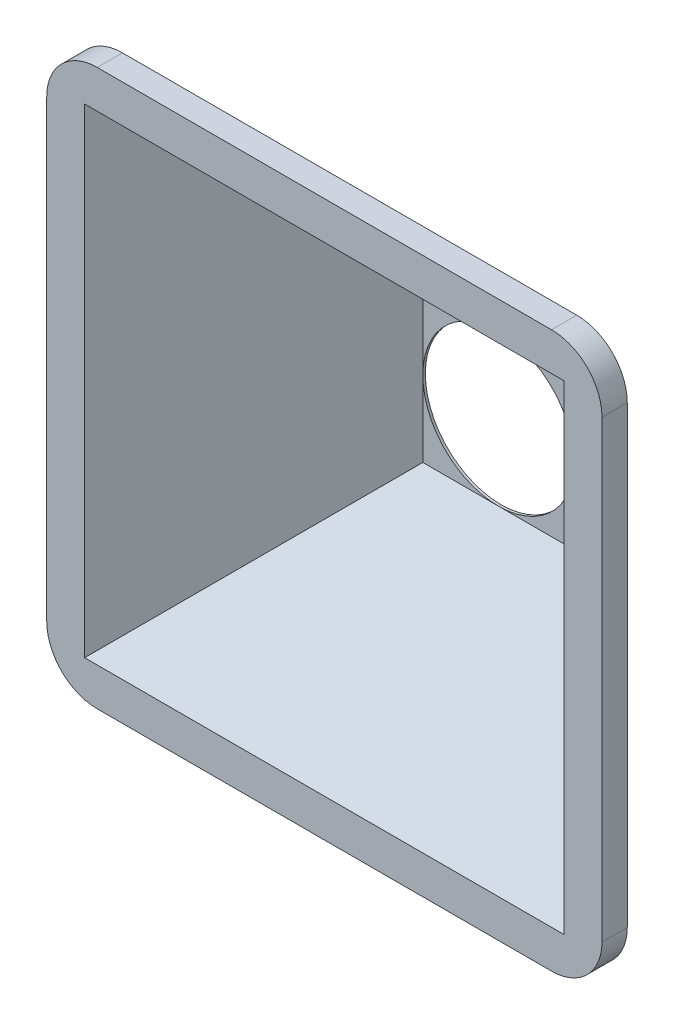
ISO-10303-21;
HEADER;
FILE_DESCRIPTION(('STEP AP214'),'2;1');
FILE_NAME('part.step','',(''),(''),'','','');
FILE_SCHEMA(('AUTOMOTIVE_DESIGN { 1 0 10303 214 1 1 1 1 }'));
ENDSEC;
DATA;
#1=APPLICATION_CONTEXT('core data for automotive mechanical design processes');
#2=APPLICATION_PROTOCOL_DEFINITION('international standard','automotive_design',2000,#1);
#3=PRODUCT_CONTEXT('',#1,'mechanical');
#4=PRODUCT('Part','Part','',(#3));
#5=PRODUCT_RELATED_PRODUCT_CATEGORY('part','',(#4));
#6=PRODUCT_DEFINITION_FORMATION('','',#4);
#7=PRODUCT_DEFINITION_CONTEXT('part definition',#1,'design');
#8=PRODUCT_DEFINITION('design','',#6,#7);
#9=PRODUCT_DEFINITION_SHAPE('','',#8);
#10=(LENGTH_UNIT() NAMED_UNIT(*) SI_UNIT(.MILLI.,.METRE.));
#11=(NAMED_UNIT(*) PLANE_ANGLE_UNIT() SI_UNIT($,.RADIAN.));
#12=(NAMED_UNIT(*) SI_UNIT($,.STERADIAN.) SOLID_ANGLE_UNIT());
#13=UNCERTAINTY_MEASURE_WITH_UNIT(LENGTH_MEASURE(1.E-05),#10,'distance_accuracy_value','');
#14=(GEOMETRIC_REPRESENTATION_CONTEXT(3) GLOBAL_UNCERTAINTY_ASSIGNED_CONTEXT((#13)) GLOBAL_UNIT_ASSIGNED_CONTEXT((#10,
#11,#12)) REPRESENTATION_CONTEXT('',''));
#15=CARTESIAN_POINT('',(0.,0.,0.));
#16=DIRECTION('',(0.,0.,1.));
#17=DIRECTION('',(1.,0.,0.));
#18=AXIS2_PLACEMENT_3D('',#15,#16,#17);
#19=CARTESIAN_POINT('',(0.,0.,5.));
#20=DIRECTION('',(0.,0.,-1.));
#21=DIRECTION('',(-1.,0.,0.));
#22=AXIS2_PLACEMENT_3D('',#19,#20,#21);
#23=CYLINDRICAL_SURFACE('',#22,150.);
#24=CARTESIAN_POINT('',(0.,0.,0.));
#25=DIRECTION('',(0.,0.,1.));
#26=DIRECTION('',(1.,0.,0.));
#27=AXIS2_PLACEMENT_3D('',#24,#25,#26);
#28=CIRCLE('',#27,150.);
#29=CARTESIAN_POINT('',(0.,-150.,0.));
#30=VERTEX_POINT('',#29);
#31=CARTESIAN_POINT('',(150.,0.,0.));
#32=VERTEX_POINT('',#31);
#33=EDGE_CURVE('E135',#30,#32,#28,.T.);
#34=ORIENTED_EDGE('',*,*,#33,.F.);
#35=DIRECTION('',(0.,0.,-1.));
#36=VECTOR('',#35,1.);
#37=CARTESIAN_POINT('',(0.,-150.,5.));
#38=LINE('',#37,#36);
#39=CARTESIAN_POINT('',(0.,-150.,5.));
#40=VERTEX_POINT('',#39);
#41=EDGE_CURVE('E13',#40,#30,#38,.T.);
#42=ORIENTED_EDGE('',*,*,#41,.F.);
#43=CARTESIAN_POINT('',(0.,0.,5.));
#44=DIRECTION('',(0.,0.,1.));
#45=DIRECTION('',(1.,0.,0.));
#46=AXIS2_PLACEMENT_3D('',#43,#44,#45);
#47=CIRCLE('',#46,150.);
#48=CARTESIAN_POINT('',(150.,0.,5.));
#49=VERTEX_POINT('',#48);
#50=EDGE_CURVE('E133',#40,#49,#47,.T.);
#51=ORIENTED_EDGE('',*,*,#50,.T.);
#52=DIRECTION('',(0.,0.,-1.));
#53=VECTOR('',#52,1.);
#54=CARTESIAN_POINT('',(150.,0.,5.));
#55=LINE('',#54,#53);
#56=EDGE_CURVE('E131',#49,#32,#55,.T.);
#57=ORIENTED_EDGE('',*,*,#56,.T.);
#58=EDGE_LOOP('',(#34,#42,#51,#57));
#59=FACE_BOUND('',#58,.T.);
#60=ADVANCED_FACE('F98',(#59),#23,.F.);
#61=CARTESIAN_POINT('',(0.,-150.,5.));
#62=DIRECTION('',(0.,-1.,0.));
#63=DIRECTION('',(0.,0.,-1.));
#64=AXIS2_PLACEMENT_3D('',#61,#62,#63);
#65=PLANE('',#64);
#66=DIRECTION('',(-1.,0.,0.));
#67=VECTOR('',#66,1.);
#68=CARTESIAN_POINT('',(0.,-150.,0.));
#69=LINE('',#68,#67);
#70=CARTESIAN_POINT('',(150.,-150.,0.));
#71=VERTEX_POINT('',#70);
#72=EDGE_CURVE('E149',#71,#30,#69,.T.);
#73=ORIENTED_EDGE('',*,*,#72,.F.);
#74=DIRECTION('',(0.,0.,-1.));
#75=VECTOR('',#74,1.);
#76=CARTESIAN_POINT('',(150.,-150.,5.));
#77=LINE('',#76,#75);
#78=CARTESIAN_POINT('',(150.,-150.,5.));
#79=VERTEX_POINT('',#78);
#80=EDGE_CURVE('E106',#79,#71,#77,.T.);
#81=ORIENTED_EDGE('',*,*,#80,.F.);
#82=DIRECTION('',(-1.,0.,0.));
#83=VECTOR('',#82,1.);
#84=CARTESIAN_POINT('',(0.,-150.,5.));
#85=LINE('',#84,#83);
#86=EDGE_CURVE('E141',#79,#40,#85,.T.);
#87=ORIENTED_EDGE('',*,*,#86,.T.);
#88=ORIENTED_EDGE('',*,*,#41,.T.);
#89=EDGE_LOOP('',(#73,#81,#87,#88));
#90=FACE_BOUND('',#89,.T.);
#91=ADVANCED_FACE('F144',(#90),#65,.T.);
#92=CARTESIAN_POINT('',(150.,0.,5.));
#93=DIRECTION('',(-1.,0.,0.));
#94=DIRECTION('',(0.,0.,1.));
#95=AXIS2_PLACEMENT_3D('',#92,#93,#94);
#96=PLANE('',#95);
#97=DIRECTION('',(0.,1.,0.));
#98=VECTOR('',#97,1.);
#99=CARTESIAN_POINT('',(150.,0.,0.));
#100=LINE('',#99,#98);
#101=EDGE_CURVE('E142',#71,#32,#100,.T.);
#102=ORIENTED_EDGE('',*,*,#101,.T.);
#103=ORIENTED_EDGE('',*,*,#56,.F.);
#104=DIRECTION('',(0.,1.,0.));
#105=VECTOR('',#104,1.);
#106=CARTESIAN_POINT('',(150.,0.,5.));
#107=LINE('',#106,#105);
#108=EDGE_CURVE('E114',#79,#49,#107,.T.);
#109=ORIENTED_EDGE('',*,*,#108,.F.);
#110=ORIENTED_EDGE('',*,*,#80,.T.);
#111=EDGE_LOOP('',(#102,#103,#109,#110));
#112=FACE_BOUND('',#111,.T.);
#113=ADVANCED_FACE('F152',(#112),#96,.F.);
#114=CARTESIAN_POINT('',(0.,0.,5.));
#115=DIRECTION('',(0.,0.,1.));
#116=DIRECTION('',(1.,0.,0.));
#117=AXIS2_PLACEMENT_3D('',#114,#115,#116);
#118=PLANE('',#117);
#119=ORIENTED_EDGE('',*,*,#50,.F.);
#120=ORIENTED_EDGE('',*,*,#86,.F.);
#121=ORIENTED_EDGE('',*,*,#108,.T.);
#122=EDGE_LOOP('',(#119,#120,#121));
#123=FACE_BOUND('',#122,.T.);
#124=ADVANCED_FACE('F140',(#123),#118,.T.);
#125=CARTESIAN_POINT('',(0.,0.,0.));
#126=DIRECTION('',(0.,0.,1.));
#127=DIRECTION('',(1.,0.,0.));
#128=AXIS2_PLACEMENT_3D('',#125,#126,#127);
#129=PLANE('',#128);
#130=ORIENTED_EDGE('',*,*,#33,.T.);
#131=ORIENTED_EDGE('',*,*,#101,.F.);
#132=ORIENTED_EDGE('',*,*,#72,.T.);
#133=EDGE_LOOP('',(#130,#131,#132));
#134=FACE_BOUND('',#133,.T.);
#135=ADVANCED_FACE('F154',(#134),#129,.F.);
#136=CLOSED_SHELL('',(#60,#91,#113,#124,#135));
#137=MANIFOLD_SOLID_BREP('B2',#136);
#138=CARTESIAN_POINT('',(0.,0.,5.));
#139=DIRECTION('',(0.,0.,-1.));
#140=DIRECTION('',(-1.,0.,0.));
#141=AXIS2_PLACEMENT_3D('',#138,#139,#140);
#142=CYLINDRICAL_SURFACE('',#141,150.);
#143=CARTESIAN_POINT('',(0.,0.,0.));
#144=DIRECTION('',(0.,0.,1.));
#145=DIRECTION('',(1.,0.,0.));
#146=AXIS2_PLACEMENT_3D('',#143,#144,#145);
#147=CIRCLE('',#146,150.);
#148=CARTESIAN_POINT('',(150.,0.,0.));
#149=VERTEX_POINT('',#148);
#150=CARTESIAN_POINT('',(0.,150.,0.));
#151=VERTEX_POINT('',#150);
#152=EDGE_CURVE('E246',#149,#151,#147,.T.);
#153=ORIENTED_EDGE('',*,*,#152,.F.);
#154=DIRECTION('',(0.,0.,-1.));
#155=VECTOR('',#154,1.);
#156=CARTESIAN_POINT('',(150.,0.,5.));
#157=LINE('',#156,#155);
#158=CARTESIAN_POINT('',(150.,0.,5.));
#159=VERTEX_POINT('',#158);
#160=EDGE_CURVE('E96',#159,#149,#157,.T.);
#161=ORIENTED_EDGE('',*,*,#160,.F.);
#162=CARTESIAN_POINT('',(0.,0.,5.));
#163=DIRECTION('',(0.,0.,1.));
#164=DIRECTION('',(1.,0.,0.));
#165=AXIS2_PLACEMENT_3D('',#162,#163,#164);
#166=CIRCLE('',#165,150.);
#167=CARTESIAN_POINT('',(0.,150.,5.));
#168=VERTEX_POINT('',#167);
#169=EDGE_CURVE('E244',#159,#168,#166,.T.);
#170=ORIENTED_EDGE('',*,*,#169,.T.);
#171=DIRECTION('',(0.,0.,-1.));
#172=VECTOR('',#171,1.);
#173=CARTESIAN_POINT('',(0.,150.,5.));
#174=LINE('',#173,#172);
#175=EDGE_CURVE('E240',#168,#151,#174,.T.);
#176=ORIENTED_EDGE('',*,*,#175,.T.);
#177=EDGE_LOOP('',(#153,#161,#170,#176));
#178=FACE_BOUND('',#177,.T.);
#179=ADVANCED_FACE('F206',(#178),#142,.F.);
#180=CARTESIAN_POINT('',(150.,0.,5.));
#181=DIRECTION('',(-1.,0.,0.));
#182=DIRECTION('',(0.,0.,1.));
#183=AXIS2_PLACEMENT_3D('',#180,#181,#182);
#184=PLANE('',#183);
#185=DIRECTION('',(0.,1.,0.));
#186=VECTOR('',#185,1.);
#187=CARTESIAN_POINT('',(150.,0.,0.));
#188=LINE('',#187,#186);
#189=CARTESIAN_POINT('',(150.,150.,0.));
#190=VERTEX_POINT('',#189);
#191=EDGE_CURVE('E234',#149,#190,#188,.T.);
#192=ORIENTED_EDGE('',*,*,#191,.T.);
#193=DIRECTION('',(0.,0.,-1.));
#194=VECTOR('',#193,1.);
#195=CARTESIAN_POINT('',(150.,150.,5.));
#196=LINE('',#195,#194);
#197=CARTESIAN_POINT('',(150.,150.,5.));
#198=VERTEX_POINT('',#197);
#199=EDGE_CURVE('E214',#198,#190,#196,.T.);
#200=ORIENTED_EDGE('',*,*,#199,.F.);
#201=DIRECTION('',(0.,1.,0.));
#202=VECTOR('',#201,1.);
#203=CARTESIAN_POINT('',(150.,0.,5.));
#204=LINE('',#203,#202);
#205=EDGE_CURVE('E247',#159,#198,#204,.T.);
#206=ORIENTED_EDGE('',*,*,#205,.F.);
#207=ORIENTED_EDGE('',*,*,#160,.T.);
#208=EDGE_LOOP('',(#192,#200,#206,#207));
#209=FACE_BOUND('',#208,.T.);
#210=ADVANCED_FACE('F248',(#209),#184,.F.);
#211=CARTESIAN_POINT('',(0.,150.,5.));
#212=DIRECTION('',(0.,-1.,0.));
#213=DIRECTION('',(0.,0.,-1.));
#214=AXIS2_PLACEMENT_3D('',#211,#212,#213);
#215=PLANE('',#214);
#216=DIRECTION('',(-1.,0.,0.));
#217=VECTOR('',#216,1.);
#218=CARTESIAN_POINT('',(0.,150.,0.));
#219=LINE('',#218,#217);
#220=EDGE_CURVE('E251',#190,#151,#219,.T.);
#221=ORIENTED_EDGE('',*,*,#220,.T.);
#222=ORIENTED_EDGE('',*,*,#175,.F.);
#223=DIRECTION('',(-1.,0.,0.));
#224=VECTOR('',#223,1.);
#225=CARTESIAN_POINT('',(0.,150.,5.));
#226=LINE('',#225,#224);
#227=EDGE_CURVE('E222',#198,#168,#226,.T.);
#228=ORIENTED_EDGE('',*,*,#227,.F.);
#229=ORIENTED_EDGE('',*,*,#199,.T.);
#230=EDGE_LOOP('',(#221,#222,#228,#229));
#231=FACE_BOUND('',#230,.T.);
#232=ADVANCED_FACE('F260',(#231),#215,.F.);
#233=CARTESIAN_POINT('',(0.,0.,5.));
#234=DIRECTION('',(0.,0.,1.));
#235=DIRECTION('',(1.,0.,0.));
#236=AXIS2_PLACEMENT_3D('',#233,#234,#235);
#237=PLANE('',#236);
#238=ORIENTED_EDGE('',*,*,#169,.F.);
#239=ORIENTED_EDGE('',*,*,#205,.T.);
#240=ORIENTED_EDGE('',*,*,#227,.T.);
#241=EDGE_LOOP('',(#238,#239,#240));
#242=FACE_BOUND('',#241,.T.);
#243=ADVANCED_FACE('F250',(#242),#237,.T.);
#244=CARTESIAN_POINT('',(0.,0.,0.));
#245=DIRECTION('',(0.,0.,1.));
#246=DIRECTION('',(1.,0.,0.));
#247=AXIS2_PLACEMENT_3D('',#244,#245,#246);
#248=PLANE('',#247);
#249=ORIENTED_EDGE('',*,*,#152,.T.);
#250=ORIENTED_EDGE('',*,*,#220,.F.);
#251=ORIENTED_EDGE('',*,*,#191,.F.);
#252=EDGE_LOOP('',(#249,#250,#251));
#253=FACE_BOUND('',#252,.T.);
#254=ADVANCED_FACE('F262',(#253),#248,.F.);
#255=CLOSED_SHELL('',(#179,#210,#232,#243,#254));
#256=MANIFOLD_SOLID_BREP('B7',#255);
#257=CARTESIAN_POINT('',(0.,0.,5.));
#258=DIRECTION('',(0.,0.,-1.));
#259=DIRECTION('',(-1.,0.,0.));
#260=AXIS2_PLACEMENT_3D('',#257,#258,#259);
#261=CYLINDRICAL_SURFACE('',#260,150.);
#262=CARTESIAN_POINT('',(0.,0.,0.));
#263=DIRECTION('',(0.,0.,1.));
#264=DIRECTION('',(1.,0.,0.));
#265=AXIS2_PLACEMENT_3D('',#262,#263,#264);
#266=CIRCLE('',#265,150.);
#267=CARTESIAN_POINT('',(-150.,0.,0.));
#268=VERTEX_POINT('',#267);
#269=CARTESIAN_POINT('',(0.,-150.,0.));
#270=VERTEX_POINT('',#269);
#271=EDGE_CURVE('E348',#268,#270,#266,.T.);
#272=ORIENTED_EDGE('',*,*,#271,.F.);
#273=DIRECTION('',(0.,0.,-1.));
#274=VECTOR('',#273,1.);
#275=CARTESIAN_POINT('',(-150.,0.,5.));
#276=LINE('',#275,#274);
#277=CARTESIAN_POINT('',(-150.,0.,5.));
#278=VERTEX_POINT('',#277);
#279=EDGE_CURVE('E204',#278,#268,#276,.T.);
#280=ORIENTED_EDGE('',*,*,#279,.F.);
#281=CARTESIAN_POINT('',(0.,0.,5.));
#282=DIRECTION('',(0.,0.,1.));
#283=DIRECTION('',(1.,0.,0.));
#284=AXIS2_PLACEMENT_3D('',#281,#282,#283);
#285=CIRCLE('',#284,150.);
#286=CARTESIAN_POINT('',(0.,-150.,5.));
#287=VERTEX_POINT('',#286);
#288=EDGE_CURVE('E346',#278,#287,#285,.T.);
#289=ORIENTED_EDGE('',*,*,#288,.T.);
#290=DIRECTION('',(0.,0.,-1.));
#291=VECTOR('',#290,1.);
#292=CARTESIAN_POINT('',(0.,-150.,5.));
#293=LINE('',#292,#291);
#294=EDGE_CURVE('E330',#287,#270,#293,.T.);
#295=ORIENTED_EDGE('',*,*,#294,.T.);
#296=EDGE_LOOP('',(#272,#280,#289,#295));
#297=FACE_BOUND('',#296,.T.);
#298=ADVANCED_FACE('F314',(#297),#261,.F.);
#299=CARTESIAN_POINT('',(-150.,0.,5.));
#300=DIRECTION('',(-1.,0.,0.));
#301=DIRECTION('',(0.,0.,1.));
#302=AXIS2_PLACEMENT_3D('',#299,#300,#301);
#303=PLANE('',#302);
#304=DIRECTION('',(0.,1.,0.));
#305=VECTOR('',#304,1.);
#306=CARTESIAN_POINT('',(-150.,0.,0.));
#307=LINE('',#306,#305);
#308=CARTESIAN_POINT('',(-150.,-150.,0.));
#309=VERTEX_POINT('',#308);
#310=EDGE_CURVE('E364',#309,#268,#307,.T.);
#311=ORIENTED_EDGE('',*,*,#310,.F.);
#312=DIRECTION('',(0.,0.,-1.));
#313=VECTOR('',#312,1.);
#314=CARTESIAN_POINT('',(-150.,-150.,5.));
#315=LINE('',#314,#313);
#316=CARTESIAN_POINT('',(-150.,-150.,5.));
#317=VERTEX_POINT('',#316);
#318=EDGE_CURVE('E322',#317,#309,#315,.T.);
#319=ORIENTED_EDGE('',*,*,#318,.F.);
#320=DIRECTION('',(0.,1.,0.));
#321=VECTOR('',#320,1.);
#322=CARTESIAN_POINT('',(-150.,0.,5.));
#323=LINE('',#322,#321);
#324=EDGE_CURVE('E355',#317,#278,#323,.T.);
#325=ORIENTED_EDGE('',*,*,#324,.T.);
#326=ORIENTED_EDGE('',*,*,#279,.T.);
#327=EDGE_LOOP('',(#311,#319,#325,#326));
#328=FACE_BOUND('',#327,.T.);
#329=ADVANCED_FACE('F359',(#328),#303,.T.);
#330=CARTESIAN_POINT('',(0.,-150.,5.));
#331=DIRECTION('',(0.,-1.,0.));
#332=DIRECTION('',(0.,0.,-1.));
#333=AXIS2_PLACEMENT_3D('',#330,#331,#332);
#334=PLANE('',#333);
#335=DIRECTION('',(-1.,0.,0.));
#336=VECTOR('',#335,1.);
#337=CARTESIAN_POINT('',(0.,-150.,0.));
#338=LINE('',#337,#336);
#339=EDGE_CURVE('E357',#270,#309,#338,.T.);
#340=ORIENTED_EDGE('',*,*,#339,.F.);
#341=ORIENTED_EDGE('',*,*,#294,.F.);
#342=DIRECTION('',(-1.,0.,0.));
#343=VECTOR('',#342,1.);
#344=CARTESIAN_POINT('',(0.,-150.,5.));
#345=LINE('',#344,#343);
#346=EDGE_CURVE('E356',#287,#317,#345,.T.);
#347=ORIENTED_EDGE('',*,*,#346,.T.);
#348=ORIENTED_EDGE('',*,*,#318,.T.);
#349=EDGE_LOOP('',(#340,#341,#347,#348));
#350=FACE_BOUND('',#349,.T.);
#351=ADVANCED_FACE('F370',(#350),#334,.T.);
#352=CARTESIAN_POINT('',(0.,0.,5.));
#353=DIRECTION('',(0.,0.,1.));
#354=DIRECTION('',(1.,0.,0.));
#355=AXIS2_PLACEMENT_3D('',#352,#353,#354);
#356=PLANE('',#355);
#357=ORIENTED_EDGE('',*,*,#288,.F.);
#358=ORIENTED_EDGE('',*,*,#324,.F.);
#359=ORIENTED_EDGE('',*,*,#346,.F.);
#360=EDGE_LOOP('',(#357,#358,#359));
#361=FACE_BOUND('',#360,.T.);
#362=ADVANCED_FACE('F354',(#361),#356,.T.);
#363=CARTESIAN_POINT('',(0.,0.,0.));
#364=DIRECTION('',(0.,0.,1.));
#365=DIRECTION('',(1.,0.,0.));
#366=AXIS2_PLACEMENT_3D('',#363,#364,#365);
#367=PLANE('',#366);
#368=ORIENTED_EDGE('',*,*,#271,.T.);
#369=ORIENTED_EDGE('',*,*,#339,.T.);
#370=ORIENTED_EDGE('',*,*,#310,.T.);
#371=EDGE_LOOP('',(#368,#369,#370));
#372=FACE_BOUND('',#371,.T.);
#373=ADVANCED_FACE('F369',(#372),#367,.F.);
#374=CLOSED_SHELL('',(#298,#329,#351,#362,#373));
#375=MANIFOLD_SOLID_BREP('B90',#374);
#376=CARTESIAN_POINT('',(0.,0.,5.));
#377=DIRECTION('',(0.,0.,-1.));
#378=DIRECTION('',(-1.,0.,0.));
#379=AXIS2_PLACEMENT_3D('',#376,#377,#378);
#380=CYLINDRICAL_SURFACE('',#379,150.);
#381=CARTESIAN_POINT('',(0.,0.,0.));
#382=DIRECTION('',(0.,0.,1.));
#383=DIRECTION('',(1.,0.,0.));
#384=AXIS2_PLACEMENT_3D('',#381,#382,#383);
#385=CIRCLE('',#384,150.);
#386=CARTESIAN_POINT('',(0.,150.,0.));
#387=VERTEX_POINT('',#386);
#388=CARTESIAN_POINT('',(-150.,0.,0.));
#389=VERTEX_POINT('',#388);
#390=EDGE_CURVE('E457',#387,#389,#385,.T.);
#391=ORIENTED_EDGE('',*,*,#390,.F.);
#392=DIRECTION('',(0.,0.,-1.));
#393=VECTOR('',#392,1.);
#394=CARTESIAN_POINT('',(0.,150.,5.));
#395=LINE('',#394,#393);
#396=CARTESIAN_POINT('',(0.,150.,5.));
#397=VERTEX_POINT('',#396);
#398=EDGE_CURVE('E312',#397,#387,#395,.T.);
#399=ORIENTED_EDGE('',*,*,#398,.F.);
#400=CARTESIAN_POINT('',(0.,0.,5.));
#401=DIRECTION('',(0.,0.,1.));
#402=DIRECTION('',(1.,0.,0.));
#403=AXIS2_PLACEMENT_3D('',#400,#401,#402);
#404=CIRCLE('',#403,150.);
#405=CARTESIAN_POINT('',(-150.,0.,5.));
#406=VERTEX_POINT('',#405);
#407=EDGE_CURVE('E455',#397,#406,#404,.T.);
#408=ORIENTED_EDGE('',*,*,#407,.T.);
#409=DIRECTION('',(0.,0.,-1.));
#410=VECTOR('',#409,1.);
#411=CARTESIAN_POINT('',(-150.,0.,5.));
#412=LINE('',#411,#410);
#413=EDGE_CURVE('E437',#406,#389,#412,.T.);
#414=ORIENTED_EDGE('',*,*,#413,.T.);
#415=EDGE_LOOP('',(#391,#399,#408,#414));
#416=FACE_BOUND('',#415,.T.);
#417=ADVANCED_FACE('F421',(#416),#380,.F.);
#418=CARTESIAN_POINT('',(0.,150.,5.));
#419=DIRECTION('',(0.,-1.,0.));
#420=DIRECTION('',(0.,0.,-1.));
#421=AXIS2_PLACEMENT_3D('',#418,#419,#420);
#422=PLANE('',#421);
#423=DIRECTION('',(-1.,0.,0.));
#424=VECTOR('',#423,1.);
#425=CARTESIAN_POINT('',(0.,150.,0.));
#426=LINE('',#425,#424);
#427=CARTESIAN_POINT('',(-150.,150.,0.));
#428=VERTEX_POINT('',#427);
#429=EDGE_CURVE('E469',#387,#428,#426,.T.);
#430=ORIENTED_EDGE('',*,*,#429,.T.);
#431=DIRECTION('',(0.,0.,-1.));
#432=VECTOR('',#431,1.);
#433=CARTESIAN_POINT('',(-150.,150.,5.));
#434=LINE('',#433,#432);
#435=CARTESIAN_POINT('',(-150.,150.,5.));
#436=VERTEX_POINT('',#435);
#437=EDGE_CURVE('E429',#436,#428,#434,.T.);
#438=ORIENTED_EDGE('',*,*,#437,.F.);
#439=DIRECTION('',(-1.,0.,0.));
#440=VECTOR('',#439,1.);
#441=CARTESIAN_POINT('',(0.,150.,5.));
#442=LINE('',#441,#440);
#443=EDGE_CURVE('E460',#397,#436,#442,.T.);
#444=ORIENTED_EDGE('',*,*,#443,.F.);
#445=ORIENTED_EDGE('',*,*,#398,.T.);
#446=EDGE_LOOP('',(#430,#438,#444,#445));
#447=FACE_BOUND('',#446,.T.);
#448=ADVANCED_FACE('F461',(#447),#422,.F.);
#449=CARTESIAN_POINT('',(-150.,0.,5.));
#450=DIRECTION('',(-1.,0.,0.));
#451=DIRECTION('',(0.,0.,1.));
#452=AXIS2_PLACEMENT_3D('',#449,#450,#451);
#453=PLANE('',#452);
#454=DIRECTION('',(0.,1.,0.));
#455=VECTOR('',#454,1.);
#456=CARTESIAN_POINT('',(-150.,0.,0.));
#457=LINE('',#456,#455);
#458=EDGE_CURVE('E466',#389,#428,#457,.T.);
#459=ORIENTED_EDGE('',*,*,#458,.F.);
#460=ORIENTED_EDGE('',*,*,#413,.F.);
#461=DIRECTION('',(0.,1.,0.));
#462=VECTOR('',#461,1.);
#463=CARTESIAN_POINT('',(-150.,0.,5.));
#464=LINE('',#463,#462);
#465=EDGE_CURVE('E463',#406,#436,#464,.T.);
#466=ORIENTED_EDGE('',*,*,#465,.T.);
#467=ORIENTED_EDGE('',*,*,#437,.T.);
#468=EDGE_LOOP('',(#459,#460,#466,#467));
#469=FACE_BOUND('',#468,.T.);
#470=ADVANCED_FACE('F477',(#469),#453,.T.);
#471=CARTESIAN_POINT('',(0.,0.,5.));
#472=DIRECTION('',(0.,0.,1.));
#473=DIRECTION('',(1.,0.,0.));
#474=AXIS2_PLACEMENT_3D('',#471,#472,#473);
#475=PLANE('',#474);
#476=ORIENTED_EDGE('',*,*,#407,.F.);
#477=ORIENTED_EDGE('',*,*,#443,.T.);
#478=ORIENTED_EDGE('',*,*,#465,.F.);
#479=EDGE_LOOP('',(#476,#477,#478));
#480=FACE_BOUND('',#479,.T.);
#481=ADVANCED_FACE('F465',(#480),#475,.T.);
#482=CARTESIAN_POINT('',(0.,0.,0.));
#483=DIRECTION('',(0.,0.,1.));
#484=DIRECTION('',(1.,0.,0.));
#485=AXIS2_PLACEMENT_3D('',#482,#483,#484);
#486=PLANE('',#485);
#487=ORIENTED_EDGE('',*,*,#390,.T.);
#488=ORIENTED_EDGE('',*,*,#458,.T.);
#489=ORIENTED_EDGE('',*,*,#429,.F.);
#490=EDGE_LOOP('',(#487,#488,#489));
#491=FACE_BOUND('',#490,.T.);
#492=ADVANCED_FACE('F476',(#491),#486,.F.);
#493=CLOSED_SHELL('',(#417,#448,#470,#481,#492));
#494=MANIFOLD_SOLID_BREP('B198',#493);
#495=CARTESIAN_POINT('',(0.,0.,0.));
#496=DIRECTION('',(0.,0.,1.));
#497=DIRECTION('',(1.,0.,0.));
#498=AXIS2_PLACEMENT_3D('',#495,#496,#497);
#499=PLANE('',#498);
#500=DIRECTION('',(1.,0.,0.));
#501=VECTOR('',#500,1.);
#502=CARTESIAN_POINT('',(-150.,150.,0.));
#503=LINE('',#502,#501);
#504=CARTESIAN_POINT('',(-150.,150.,0.));
#505=VERTEX_POINT('',#504);
#506=CARTESIAN_POINT('',(150.,150.,0.));
#507=VERTEX_POINT('',#506);
#508=EDGE_CURVE('E537',#505,#507,#503,.T.);
#509=ORIENTED_EDGE('',*,*,#508,.F.);
#510=DIRECTION('',(0.,1.,0.));
#511=VECTOR('',#510,1.);
#512=CARTESIAN_POINT('',(-150.,-150.,0.));
#513=LINE('',#512,#511);
#514=CARTESIAN_POINT('',(-150.,-150.,0.));
#515=VERTEX_POINT('',#514);
#516=EDGE_CURVE('E638',#515,#505,#513,.T.);
#517=ORIENTED_EDGE('',*,*,#516,.F.);
#518=DIRECTION('',(-1.,0.,0.));
#519=VECTOR('',#518,1.);
#520=CARTESIAN_POINT('',(-150.,-150.,0.));
#521=LINE('',#520,#519);
#522=CARTESIAN_POINT('',(150.,-150.,0.));
#523=VERTEX_POINT('',#522);
#524=EDGE_CURVE('E523',#523,#515,#521,.T.);
#525=ORIENTED_EDGE('',*,*,#524,.F.);
#526=DIRECTION('',(0.,-1.,0.));
#527=VECTOR('',#526,1.);
#528=CARTESIAN_POINT('',(150.,-150.,0.));
#529=LINE('',#528,#527);
#530=EDGE_CURVE('E659',#507,#523,#529,.T.);
#531=ORIENTED_EDGE('',*,*,#530,.F.);
#532=EDGE_LOOP('',(#509,#517,#525,#531));
#533=FACE_BOUND('',#532,.T.);
#534=DIRECTION('',(0.,-1.,0.));
#535=VECTOR('',#534,1.);
#536=CARTESIAN_POINT('',(-200.,-200.,0.));
#537=LINE('',#536,#535);
#538=CARTESIAN_POINT('',(-200.,200.,0.));
#539=VERTEX_POINT('',#538);
#540=CARTESIAN_POINT('',(-200.,-200.,0.));
#541=VERTEX_POINT('',#540);
#542=EDGE_CURVE('E1058',#539,#541,#537,.T.);
#543=ORIENTED_EDGE('',*,*,#542,.F.);
#544=DIRECTION('',(-1.,0.,0.));
#545=VECTOR('',#544,1.);
#546=CARTESIAN_POINT('',(200.,200.,0.));
#547=LINE('',#546,#545);
#548=CARTESIAN_POINT('',(200.,200.,0.));
#549=VERTEX_POINT('',#548);
#550=EDGE_CURVE('E1056',#549,#539,#547,.T.);
#551=ORIENTED_EDGE('',*,*,#550,.F.);
#552=DIRECTION('',(0.,1.,0.));
#553=VECTOR('',#552,1.);
#554=CARTESIAN_POINT('',(200.,-200.,0.));
#555=LINE('',#554,#553);
#556=CARTESIAN_POINT('',(200.,-200.,0.));
#557=VERTEX_POINT('',#556);
#558=EDGE_CURVE('E1051',#557,#549,#555,.T.);
#559=ORIENTED_EDGE('',*,*,#558,.F.);
#560=DIRECTION('',(1.,0.,0.));
#561=VECTOR('',#560,1.);
#562=CARTESIAN_POINT('',(200.,-200.,0.));
#563=LINE('',#562,#561);
#564=EDGE_CURVE('E983',#541,#557,#563,.T.);
#565=ORIENTED_EDGE('',*,*,#564,.F.);
#566=EDGE_LOOP('',(#543,#551,#559,#565));
#567=FACE_BOUND('',#566,.T.);
#568=ADVANCED_FACE('F519',(#533,#567),#499,.F.);
#569=CARTESIAN_POINT('',(-100.,0.,-100.));
#570=DIRECTION('',(-0.707106781186548,0.,-0.707106781186547));
#571=DIRECTION('',(-0.707106781186547,0.,0.707106781186548));
#572=AXIS2_PLACEMENT_3D('',#569,#570,#571);
#573=PLANE('',#572);
#574=DIRECTION('',(-0.577350269189625,-0.577350269189626,0.577350269189626));
#575=VECTOR('',#574,1.);
#576=CARTESIAN_POINT('',(-200.,-200.,0.));
#577=LINE('',#576,#575);
#578=CARTESIAN_POINT('',(-500.,-500.,300.));
#579=VERTEX_POINT('',#578);
#580=EDGE_CURVE('E989',#541,#579,#577,.T.);
#581=ORIENTED_EDGE('',*,*,#580,.T.);
#582=DIRECTION('',(0.,-1.,0.));
#583=VECTOR('',#582,1.);
#584=CARTESIAN_POINT('',(-500.,-500.,300.));
#585=LINE('',#584,#583);
#586=CARTESIAN_POINT('',(-500.,500.,300.));
#587=VERTEX_POINT('',#586);
#588=EDGE_CURVE('E908',#587,#579,#585,.T.);
#589=ORIENTED_EDGE('',*,*,#588,.F.);
#590=DIRECTION('',(-0.577350269189626,0.577350269189626,0.577350269189626));
#591=VECTOR('',#590,1.);
#592=CARTESIAN_POINT('',(-200.,200.,0.));
#593=LINE('',#592,#591);
#594=EDGE_CURVE('E1245',#539,#587,#593,.T.);
#595=ORIENTED_EDGE('',*,*,#594,.F.);
#596=ORIENTED_EDGE('',*,*,#542,.T.);
#597=EDGE_LOOP('',(#581,#589,#595,#596));
#598=FACE_BOUND('',#597,.T.);
#599=ADVANCED_FACE('F680',(#598),#573,.T.);
#600=CARTESIAN_POINT('',(0.,100.,-100.));
#601=DIRECTION('',(0.,0.707106781186548,-0.707106781186547));
#602=DIRECTION('',(0.,0.707106781186547,0.707106781186548));
#603=AXIS2_PLACEMENT_3D('',#600,#601,#602);
#604=PLANE('',#603);
#605=ORIENTED_EDGE('',*,*,#594,.T.);
#606=DIRECTION('',(-1.,0.,0.));
#607=VECTOR('',#606,1.);
#608=CARTESIAN_POINT('',(500.,500.,300.));
#609=LINE('',#608,#607);
#610=CARTESIAN_POINT('',(500.,500.,300.));
#611=VERTEX_POINT('',#610);
#612=EDGE_CURVE('E912',#611,#587,#609,.T.);
#613=ORIENTED_EDGE('',*,*,#612,.F.);
#614=DIRECTION('',(0.577350269189626,0.577350269189626,0.577350269189626));
#615=VECTOR('',#614,1.);
#616=CARTESIAN_POINT('',(200.,200.,0.));
#617=LINE('',#616,#615);
#618=EDGE_CURVE('E913',#549,#611,#617,.T.);
#619=ORIENTED_EDGE('',*,*,#618,.F.);
#620=ORIENTED_EDGE('',*,*,#550,.T.);
#621=EDGE_LOOP('',(#605,#613,#619,#620));
#622=FACE_BOUND('',#621,.T.);
#623=ADVANCED_FACE('F1000',(#622),#604,.T.);
#624=CARTESIAN_POINT('',(0.,-100.,-100.));
#625=DIRECTION('',(0.,-0.707106781186547,-0.707106781186548));
#626=DIRECTION('',(0.,0.707106781186548,-0.707106781186547));
#627=AXIS2_PLACEMENT_3D('',#624,#625,#626);
#628=PLANE('',#627);
#629=DIRECTION('',(0.577350269189626,-0.577350269189626,0.577350269189626));
#630=VECTOR('',#629,1.);
#631=CARTESIAN_POINT('',(200.,-200.,0.));
#632=LINE('',#631,#630);
#633=CARTESIAN_POINT('',(500.,-500.,300.));
#634=VERTEX_POINT('',#633);
#635=EDGE_CURVE('E1246',#557,#634,#632,.T.);
#636=ORIENTED_EDGE('',*,*,#635,.T.);
#637=DIRECTION('',(1.,0.,0.));
#638=VECTOR('',#637,1.);
#639=CARTESIAN_POINT('',(500.,-500.,300.));
#640=LINE('',#639,#638);
#641=EDGE_CURVE('E907',#579,#634,#640,.T.);
#642=ORIENTED_EDGE('',*,*,#641,.F.);
#643=ORIENTED_EDGE('',*,*,#580,.F.);
#644=ORIENTED_EDGE('',*,*,#564,.T.);
#645=EDGE_LOOP('',(#636,#642,#643,#644));
#646=FACE_BOUND('',#645,.T.);
#647=ADVANCED_FACE('F991',(#646),#628,.T.);
#648=CARTESIAN_POINT('',(100.,0.,-100.));
#649=DIRECTION('',(0.707106781186548,0.,-0.707106781186548));
#650=DIRECTION('',(-0.707106781186548,0.,-0.707106781186548));
#651=AXIS2_PLACEMENT_3D('',#648,#649,#650);
#652=PLANE('',#651);
#653=ORIENTED_EDGE('',*,*,#618,.T.);
#654=DIRECTION('',(0.,1.,0.));
#655=VECTOR('',#654,1.);
#656=CARTESIAN_POINT('',(500.,-500.,300.));
#657=LINE('',#656,#655);
#658=EDGE_CURVE('E922',#634,#611,#657,.T.);
#659=ORIENTED_EDGE('',*,*,#658,.F.);
#660=ORIENTED_EDGE('',*,*,#635,.F.);
#661=ORIENTED_EDGE('',*,*,#558,.T.);
#662=EDGE_LOOP('',(#653,#659,#660,#661));
#663=FACE_BOUND('',#662,.T.);
#664=ADVANCED_FACE('F951',(#663),#652,.T.);
#665=CARTESIAN_POINT('',(0.,0.,300.));
#666=DIRECTION('',(0.,0.,1.));
#667=DIRECTION('',(1.,0.,0.));
#668=AXIS2_PLACEMENT_3D('',#665,#666,#667);
#669=PLANE('',#668);
#670=DIRECTION('',(-1.,0.,0.));
#671=VECTOR('',#670,1.);
#672=CARTESIAN_POINT('',(550.001591425543,550.190105160312,300.));
#673=LINE('',#672,#671);
#674=CARTESIAN_POINT('',(450.001591425543,550.190105160312,300.));
#675=VERTEX_POINT('',#674);
#676=CARTESIAN_POINT('',(-450.001591425543,550.190105160311,300.));
#677=VERTEX_POINT('',#676);
#678=EDGE_CURVE('E938',#675,#677,#673,.T.);
#679=ORIENTED_EDGE('',*,*,#678,.F.);
#680=CARTESIAN_POINT('',(450.001591425543,450.190105160312,300.));
#681=DIRECTION('',(0.,0.,1.));
#682=DIRECTION('',(1.,0.,0.));
#683=AXIS2_PLACEMENT_3D('',#680,#681,#682);
#684=CIRCLE('',#683,100.);
#685=CARTESIAN_POINT('',(550.001591425543,450.190105160312,300.));
#686=VERTEX_POINT('',#685);
#687=EDGE_CURVE('E871',#675,#686,#684,.F.);
#688=ORIENTED_EDGE('',*,*,#687,.T.);
#689=DIRECTION('',(0.,1.,0.));
#690=VECTOR('',#689,1.);
#691=CARTESIAN_POINT('',(550.001591425543,-550.190105160312,300.));
#692=LINE('',#691,#690);
#693=CARTESIAN_POINT('',(550.001591425543,-450.190105160312,300.));
#694=VERTEX_POINT('',#693);
#695=EDGE_CURVE('E1074',#694,#686,#692,.T.);
#696=ORIENTED_EDGE('',*,*,#695,.F.);
#697=CARTESIAN_POINT('',(450.001591425543,-450.190105160312,300.));
#698=DIRECTION('',(0.,0.,1.));
#699=DIRECTION('',(1.,0.,0.));
#700=AXIS2_PLACEMENT_3D('',#697,#698,#699);
#701=CIRCLE('',#700,100.);
#702=CARTESIAN_POINT('',(450.001591425543,-550.190105160312,300.));
#703=VERTEX_POINT('',#702);
#704=EDGE_CURVE('E891',#694,#703,#701,.F.);
#705=ORIENTED_EDGE('',*,*,#704,.T.);
#706=DIRECTION('',(1.,0.,0.));
#707=VECTOR('',#706,1.);
#708=CARTESIAN_POINT('',(550.001591425543,-550.190105160312,300.));
#709=LINE('',#708,#707);
#710=CARTESIAN_POINT('',(-450.001591425543,-550.190105160312,300.));
#711=VERTEX_POINT('',#710);
#712=EDGE_CURVE('E1072',#711,#703,#709,.T.);
#713=ORIENTED_EDGE('',*,*,#712,.F.);
#714=CARTESIAN_POINT('',(-450.001591425543,-450.190105160312,300.));
#715=DIRECTION('',(0.,0.,1.));
#716=DIRECTION('',(1.,0.,0.));
#717=AXIS2_PLACEMENT_3D('',#714,#715,#716);
#718=CIRCLE('',#717,100.);
#719=CARTESIAN_POINT('',(-550.001591425543,-450.190105160312,300.));
#720=VERTEX_POINT('',#719);
#721=EDGE_CURVE('E901',#711,#720,#718,.F.);
#722=ORIENTED_EDGE('',*,*,#721,.T.);
#723=DIRECTION('',(0.,-1.,0.));
#724=VECTOR('',#723,1.);
#725=CARTESIAN_POINT('',(-550.001591425543,-550.190105160312,300.));
#726=LINE('',#725,#724);
#727=CARTESIAN_POINT('',(-550.001591425543,450.190105160312,300.));
#728=VERTEX_POINT('',#727);
#729=EDGE_CURVE('E817',#728,#720,#726,.T.);
#730=ORIENTED_EDGE('',*,*,#729,.F.);
#731=CARTESIAN_POINT('',(-450.001591425543,450.190105160312,300.));
#732=DIRECTION('',(0.,0.,1.));
#733=DIRECTION('',(1.,0.,0.));
#734=AXIS2_PLACEMENT_3D('',#731,#732,#733);
#735=CIRCLE('',#734,100.);
#736=EDGE_CURVE('E881',#728,#677,#735,.F.);
#737=ORIENTED_EDGE('',*,*,#736,.T.);
#738=EDGE_LOOP('',(#679,#688,#696,#705,#713,#722,#730,#737));
#739=FACE_BOUND('',#738,.T.);
#740=ORIENTED_EDGE('',*,*,#612,.T.);
#741=ORIENTED_EDGE('',*,*,#588,.T.);
#742=ORIENTED_EDGE('',*,*,#641,.T.);
#743=ORIENTED_EDGE('',*,*,#658,.T.);
#744=EDGE_LOOP('',(#740,#741,#742,#743));
#745=FACE_BOUND('',#744,.T.);
#746=ADVANCED_FACE('F927',(#739,#745),#669,.F.);
#747=CARTESIAN_POINT('',(-550.001591425543,-550.190105160312,350.));
#748=DIRECTION('',(1.,0.,0.));
#749=DIRECTION('',(0.,0.,-1.));
#750=AXIS2_PLACEMENT_3D('',#747,#748,#749);
#751=PLANE('',#750);
#752=DIRECTION('',(0.,-1.,0.));
#753=VECTOR('',#752,1.);
#754=CARTESIAN_POINT('',(-550.001591425543,-550.190105160312,350.));
#755=LINE('',#754,#753);
#756=CARTESIAN_POINT('',(-550.001591425543,450.190105160312,350.));
#757=VERTEX_POINT('',#756);
#758=CARTESIAN_POINT('',(-550.001591425543,-450.190105160312,350.));
#759=VERTEX_POINT('',#758);
#760=EDGE_CURVE('E1079',#757,#759,#755,.T.);
#761=ORIENTED_EDGE('',*,*,#760,.F.);
#762=DIRECTION('',(0.,0.,-1.));
#763=VECTOR('',#762,1.);
#764=CARTESIAN_POINT('',(-550.001591425543,450.190105160312,350.));
#765=LINE('',#764,#763);
#766=EDGE_CURVE('E884',#757,#728,#765,.T.);
#767=ORIENTED_EDGE('',*,*,#766,.T.);
#768=ORIENTED_EDGE('',*,*,#729,.T.);
#769=DIRECTION('',(0.,0.,-1.));
#770=VECTOR('',#769,1.);
#771=CARTESIAN_POINT('',(-550.001591425543,-450.190105160312,350.));
#772=LINE('',#771,#770);
#773=EDGE_CURVE('E898',#720,#759,#772,.F.);
#774=ORIENTED_EDGE('',*,*,#773,.T.);
#775=EDGE_LOOP('',(#761,#767,#768,#774));
#776=FACE_BOUND('',#775,.T.);
#777=ADVANCED_FACE('F681',(#776),#751,.F.);
#778=CARTESIAN_POINT('',(550.001591425543,-550.190105160312,350.));
#779=DIRECTION('',(0.,1.,0.));
#780=DIRECTION('',(0.,0.,1.));
#781=AXIS2_PLACEMENT_3D('',#778,#779,#780);
#782=PLANE('',#781);
#783=ORIENTED_EDGE('',*,*,#712,.T.);
#784=DIRECTION('',(0.,0.,-1.));
#785=VECTOR('',#784,1.);
#786=CARTESIAN_POINT('',(450.001591425543,-550.190105160312,350.));
#787=LINE('',#786,#785);
#788=CARTESIAN_POINT('',(450.001591425543,-550.190105160312,350.));
#789=VERTEX_POINT('',#788);
#790=EDGE_CURVE('E889',#703,#789,#787,.F.);
#791=ORIENTED_EDGE('',*,*,#790,.T.);
#792=DIRECTION('',(1.,0.,0.));
#793=VECTOR('',#792,1.);
#794=CARTESIAN_POINT('',(550.001591425543,-550.190105160312,350.));
#795=LINE('',#794,#793);
#796=CARTESIAN_POINT('',(-450.001591425543,-550.190105160312,350.));
#797=VERTEX_POINT('',#796);
#798=EDGE_CURVE('E1067',#797,#789,#795,.T.);
#799=ORIENTED_EDGE('',*,*,#798,.F.);
#800=DIRECTION('',(0.,0.,-1.));
#801=VECTOR('',#800,1.);
#802=CARTESIAN_POINT('',(-450.001591425543,-550.190105160312,350.));
#803=LINE('',#802,#801);
#804=EDGE_CURVE('E904',#797,#711,#803,.T.);
#805=ORIENTED_EDGE('',*,*,#804,.T.);
#806=EDGE_LOOP('',(#783,#791,#799,#805));
#807=FACE_BOUND('',#806,.T.);
#808=ADVANCED_FACE('F1119',(#807),#782,.F.);
#809=CARTESIAN_POINT('',(550.001591425543,-550.190105160312,350.));
#810=DIRECTION('',(-1.,0.,0.));
#811=DIRECTION('',(0.,0.,1.));
#812=AXIS2_PLACEMENT_3D('',#809,#810,#811);
#813=PLANE('',#812);
#814=ORIENTED_EDGE('',*,*,#695,.T.);
#815=DIRECTION('',(0.,0.,-1.));
#816=VECTOR('',#815,1.);
#817=CARTESIAN_POINT('',(550.001591425543,450.190105160312,350.));
#818=LINE('',#817,#816);
#819=CARTESIAN_POINT('',(550.001591425543,450.190105160312,350.));
#820=VERTEX_POINT('',#819);
#821=EDGE_CURVE('E529',#686,#820,#818,.F.);
#822=ORIENTED_EDGE('',*,*,#821,.T.);
#823=DIRECTION('',(0.,1.,0.));
#824=VECTOR('',#823,1.);
#825=CARTESIAN_POINT('',(550.001591425543,-550.190105160312,350.));
#826=LINE('',#825,#824);
#827=CARTESIAN_POINT('',(550.001591425543,-450.190105160312,350.));
#828=VERTEX_POINT('',#827);
#829=EDGE_CURVE('E1063',#828,#820,#826,.T.);
#830=ORIENTED_EDGE('',*,*,#829,.F.);
#831=DIRECTION('',(0.,0.,-1.));
#832=VECTOR('',#831,1.);
#833=CARTESIAN_POINT('',(550.001591425543,-450.190105160312,350.));
#834=LINE('',#833,#832);
#835=EDGE_CURVE('E893',#828,#694,#834,.T.);
#836=ORIENTED_EDGE('',*,*,#835,.T.);
#837=EDGE_LOOP('',(#814,#822,#830,#836));
#838=FACE_BOUND('',#837,.T.);
#839=ADVANCED_FACE('F1104',(#838),#813,.F.);
#840=CARTESIAN_POINT('',(550.001591425543,550.190105160312,350.));
#841=DIRECTION('',(0.,-1.,0.));
#842=DIRECTION('',(1.,0.,0.));
#843=AXIS2_PLACEMENT_3D('',#840,#841,#842);
#844=PLANE('',#843);
#845=DIRECTION('',(-1.,0.,0.));
#846=VECTOR('',#845,1.);
#847=CARTESIAN_POINT('',(550.001591425543,550.190105160312,350.));
#848=LINE('',#847,#846);
#849=CARTESIAN_POINT('',(450.001591425543,550.190105160312,350.));
#850=VERTEX_POINT('',#849);
#851=CARTESIAN_POINT('',(-450.001591425543,550.190105160311,350.));
#852=VERTEX_POINT('',#851);
#853=EDGE_CURVE('E1062',#850,#852,#848,.T.);
#854=ORIENTED_EDGE('',*,*,#853,.F.);
#855=DIRECTION('',(0.,0.,-1.));
#856=VECTOR('',#855,1.);
#857=CARTESIAN_POINT('',(450.001591425543,550.190105160312,350.));
#858=LINE('',#857,#856);
#859=EDGE_CURVE('E873',#850,#675,#858,.T.);
#860=ORIENTED_EDGE('',*,*,#859,.T.);
#861=ORIENTED_EDGE('',*,*,#678,.T.);
#862=DIRECTION('',(0.,0.,-1.));
#863=VECTOR('',#862,1.);
#864=CARTESIAN_POINT('',(-450.001591425543,550.190105160311,350.));
#865=LINE('',#864,#863);
#866=EDGE_CURVE('E878',#677,#852,#865,.F.);
#867=ORIENTED_EDGE('',*,*,#866,.T.);
#868=EDGE_LOOP('',(#854,#860,#861,#867));
#869=FACE_BOUND('',#868,.T.);
#870=ADVANCED_FACE('F953',(#869),#844,.F.);
#871=CARTESIAN_POINT('',(0.,0.,350.));
#872=DIRECTION('',(0.,0.,1.));
#873=DIRECTION('',(1.,0.,0.));
#874=AXIS2_PLACEMENT_3D('',#871,#872,#873);
#875=PLANE('',#874);
#876=DIRECTION('',(0.,-1.,0.));
#877=VECTOR('',#876,1.);
#878=CARTESIAN_POINT('',(-475.,-475.,350.));
#879=LINE('',#878,#877);
#880=CARTESIAN_POINT('',(-475.,475.,350.));
#881=VERTEX_POINT('',#880);
#882=CARTESIAN_POINT('',(-475.,-475.,350.));
#883=VERTEX_POINT('',#882);
#884=EDGE_CURVE('E821',#881,#883,#879,.T.);
#885=ORIENTED_EDGE('',*,*,#884,.F.);
#886=DIRECTION('',(-1.,0.,0.));
#887=VECTOR('',#886,1.);
#888=CARTESIAN_POINT('',(475.,475.,350.));
#889=LINE('',#888,#887);
#890=CARTESIAN_POINT('',(475.,475.,350.));
#891=VERTEX_POINT('',#890);
#892=EDGE_CURVE('E653',#891,#881,#889,.T.);
#893=ORIENTED_EDGE('',*,*,#892,.F.);
#894=DIRECTION('',(0.,1.,0.));
#895=VECTOR('',#894,1.);
#896=CARTESIAN_POINT('',(475.,-475.,350.));
#897=LINE('',#896,#895);
#898=CARTESIAN_POINT('',(475.,-475.,350.));
#899=VERTEX_POINT('',#898);
#900=EDGE_CURVE('E818',#899,#891,#897,.T.);
#901=ORIENTED_EDGE('',*,*,#900,.F.);
#902=DIRECTION('',(1.,0.,0.));
#903=VECTOR('',#902,1.);
#904=CARTESIAN_POINT('',(475.,-475.,350.));
#905=LINE('',#904,#903);
#906=EDGE_CURVE('E815',#883,#899,#905,.T.);
#907=ORIENTED_EDGE('',*,*,#906,.F.);
#908=EDGE_LOOP('',(#885,#893,#901,#907));
#909=FACE_BOUND('',#908,.T.);
#910=ORIENTED_EDGE('',*,*,#829,.T.);
#911=CARTESIAN_POINT('',(450.001591425543,450.190105160312,350.));
#912=DIRECTION('',(0.,0.,1.));
#913=DIRECTION('',(1.,0.,0.));
#914=AXIS2_PLACEMENT_3D('',#911,#912,#913);
#915=CIRCLE('',#914,100.);
#916=EDGE_CURVE('E419',#820,#850,#915,.T.);
#917=ORIENTED_EDGE('',*,*,#916,.T.);
#918=ORIENTED_EDGE('',*,*,#853,.T.);
#919=CARTESIAN_POINT('',(-450.001591425543,450.190105160312,350.));
#920=DIRECTION('',(0.,0.,1.));
#921=DIRECTION('',(1.,0.,0.));
#922=AXIS2_PLACEMENT_3D('',#919,#920,#921);
#923=CIRCLE('',#922,100.);
#924=EDGE_CURVE('E876',#852,#757,#923,.T.);
#925=ORIENTED_EDGE('',*,*,#924,.T.);
#926=ORIENTED_EDGE('',*,*,#760,.T.);
#927=CARTESIAN_POINT('',(-450.001591425543,-450.190105160312,350.));
#928=DIRECTION('',(0.,0.,1.));
#929=DIRECTION('',(1.,0.,0.));
#930=AXIS2_PLACEMENT_3D('',#927,#928,#929);
#931=CIRCLE('',#930,100.);
#932=EDGE_CURVE('E896',#759,#797,#931,.T.);
#933=ORIENTED_EDGE('',*,*,#932,.T.);
#934=ORIENTED_EDGE('',*,*,#798,.T.);
#935=CARTESIAN_POINT('',(450.001591425543,-450.190105160312,350.));
#936=DIRECTION('',(0.,0.,1.));
#937=DIRECTION('',(1.,0.,0.));
#938=AXIS2_PLACEMENT_3D('',#935,#936,#937);
#939=CIRCLE('',#938,100.);
#940=EDGE_CURVE('E887',#789,#828,#939,.T.);
#941=ORIENTED_EDGE('',*,*,#940,.T.);
#942=EDGE_LOOP('',(#910,#917,#918,#925,#926,#933,#934,#941));
#943=FACE_BOUND('',#942,.T.);
#944=ADVANCED_FACE('F750',(#909,#943),#875,.T.);
#945=CARTESIAN_POINT('',(-450.001591425543,-450.190105160312,350.));
#946=DIRECTION('',(0.,0.,-1.));
#947=DIRECTION('',(-1.,0.,0.));
#948=AXIS2_PLACEMENT_3D('',#945,#946,#947);
#949=CYLINDRICAL_SURFACE('',#948,100.);
#950=ORIENTED_EDGE('',*,*,#932,.F.);
#951=ORIENTED_EDGE('',*,*,#773,.F.);
#952=ORIENTED_EDGE('',*,*,#721,.F.);
#953=ORIENTED_EDGE('',*,*,#804,.F.);
#954=EDGE_LOOP('',(#950,#951,#952,#953));
#955=FACE_BOUND('',#954,.T.);
#956=ADVANCED_FACE('F1118',(#955),#949,.T.);
#957=CARTESIAN_POINT('',(450.001591425543,-450.190105160312,350.));
#958=DIRECTION('',(0.,0.,-1.));
#959=DIRECTION('',(-1.,0.,0.));
#960=AXIS2_PLACEMENT_3D('',#957,#958,#959);
#961=CYLINDRICAL_SURFACE('',#960,100.);
#962=ORIENTED_EDGE('',*,*,#940,.F.);
#963=ORIENTED_EDGE('',*,*,#790,.F.);
#964=ORIENTED_EDGE('',*,*,#704,.F.);
#965=ORIENTED_EDGE('',*,*,#835,.F.);
#966=EDGE_LOOP('',(#962,#963,#964,#965));
#967=FACE_BOUND('',#966,.T.);
#968=ADVANCED_FACE('F1103',(#967),#961,.T.);
#969=CARTESIAN_POINT('',(-450.001591425543,450.190105160312,350.));
#970=DIRECTION('',(0.,0.,-1.));
#971=DIRECTION('',(-1.,0.,0.));
#972=AXIS2_PLACEMENT_3D('',#969,#970,#971);
#973=CYLINDRICAL_SURFACE('',#972,100.);
#974=ORIENTED_EDGE('',*,*,#924,.F.);
#975=ORIENTED_EDGE('',*,*,#866,.F.);
#976=ORIENTED_EDGE('',*,*,#736,.F.);
#977=ORIENTED_EDGE('',*,*,#766,.F.);
#978=EDGE_LOOP('',(#974,#975,#976,#977));
#979=FACE_BOUND('',#978,.T.);
#980=ADVANCED_FACE('F1113',(#979),#973,.T.);
#981=CARTESIAN_POINT('',(450.001591425543,450.190105160312,350.));
#982=DIRECTION('',(0.,0.,-1.));
#983=DIRECTION('',(-1.,0.,0.));
#984=AXIS2_PLACEMENT_3D('',#981,#982,#983);
#985=CYLINDRICAL_SURFACE('',#984,100.);
#986=ORIENTED_EDGE('',*,*,#916,.F.);
#987=ORIENTED_EDGE('',*,*,#821,.F.);
#988=ORIENTED_EDGE('',*,*,#687,.F.);
#989=ORIENTED_EDGE('',*,*,#859,.F.);
#990=EDGE_LOOP('',(#986,#987,#988,#989));
#991=FACE_BOUND('',#990,.T.);
#992=ADVANCED_FACE('F521',(#991),#985,.T.);
#993=CARTESIAN_POINT('',(-80.5479452054795,0.,-74.7945205479452));
#994=DIRECTION('',(-0.732793491626299,0.,-0.680451099367278));
#995=DIRECTION('',(-0.680451099367278,0.,0.732793491626299));
#996=AXIS2_PLACEMENT_3D('',#993,#994,#995);
#997=PLANE('',#996);
#998=DIRECTION('',(-0.56256501913029,-0.56256501913029,0.605839251371082));
#999=VECTOR('',#998,1.);
#1000=CARTESIAN_POINT('',(-150.,-150.,0.));
#1001=LINE('',#1000,#999);
#1002=EDGE_CURVE('E644',#515,#883,#1001,.T.);
#1003=ORIENTED_EDGE('',*,*,#1002,.F.);
#1004=ORIENTED_EDGE('',*,*,#516,.T.);
#1005=DIRECTION('',(-0.56256501913029,0.56256501913029,0.605839251371082));
#1006=VECTOR('',#1005,1.);
#1007=CARTESIAN_POINT('',(-150.,150.,0.));
#1008=LINE('',#1007,#1006);
#1009=EDGE_CURVE('E642',#505,#881,#1008,.T.);
#1010=ORIENTED_EDGE('',*,*,#1009,.T.);
#1011=ORIENTED_EDGE('',*,*,#884,.T.);
#1012=EDGE_LOOP('',(#1003,#1004,#1010,#1011));
#1013=FACE_BOUND('',#1012,.T.);
#1014=ADVANCED_FACE('F640',(#1013),#997,.F.);
#1015=CARTESIAN_POINT('',(0.,80.5479452054795,-74.7945205479452));
#1016=DIRECTION('',(0.,0.732793491626299,-0.680451099367278));
#1017=DIRECTION('',(0.,0.680451099367278,0.732793491626299));
#1018=AXIS2_PLACEMENT_3D('',#1015,#1016,#1017);
#1019=PLANE('',#1018);
#1020=ORIENTED_EDGE('',*,*,#1009,.F.);
#1021=ORIENTED_EDGE('',*,*,#508,.T.);
#1022=DIRECTION('',(0.56256501913029,0.56256501913029,0.605839251371082));
#1023=VECTOR('',#1022,1.);
#1024=CARTESIAN_POINT('',(150.,150.,0.));
#1025=LINE('',#1024,#1023);
#1026=EDGE_CURVE('E735',#507,#891,#1025,.T.);
#1027=ORIENTED_EDGE('',*,*,#1026,.T.);
#1028=ORIENTED_EDGE('',*,*,#892,.T.);
#1029=EDGE_LOOP('',(#1020,#1021,#1027,#1028));
#1030=FACE_BOUND('',#1029,.T.);
#1031=ADVANCED_FACE('F651',(#1030),#1019,.F.);
#1032=CARTESIAN_POINT('',(0.,-80.5479452054794,-74.7945205479452));
#1033=DIRECTION('',(0.,-0.732793491626299,-0.680451099367278));
#1034=DIRECTION('',(0.,0.680451099367278,-0.732793491626299));
#1035=AXIS2_PLACEMENT_3D('',#1032,#1033,#1034);
#1036=PLANE('',#1035);
#1037=DIRECTION('',(0.56256501913029,-0.56256501913029,0.605839251371082));
#1038=VECTOR('',#1037,1.);
#1039=CARTESIAN_POINT('',(150.,-150.,0.));
#1040=LINE('',#1039,#1038);
#1041=EDGE_CURVE('E546',#523,#899,#1040,.T.);
#1042=ORIENTED_EDGE('',*,*,#1041,.F.);
#1043=ORIENTED_EDGE('',*,*,#524,.T.);
#1044=ORIENTED_EDGE('',*,*,#1002,.T.);
#1045=ORIENTED_EDGE('',*,*,#906,.T.);
#1046=EDGE_LOOP('',(#1042,#1043,#1044,#1045));
#1047=FACE_BOUND('',#1046,.T.);
#1048=ADVANCED_FACE('F747',(#1047),#1036,.F.);
#1049=CARTESIAN_POINT('',(80.5479452054795,0.,-74.7945205479453));
#1050=DIRECTION('',(0.732793491626299,0.,-0.680451099367278));
#1051=DIRECTION('',(-0.680451099367278,0.,-0.732793491626299));
#1052=AXIS2_PLACEMENT_3D('',#1049,#1050,#1051);
#1053=PLANE('',#1052);
#1054=ORIENTED_EDGE('',*,*,#1026,.F.);
#1055=ORIENTED_EDGE('',*,*,#530,.T.);
#1056=ORIENTED_EDGE('',*,*,#1041,.T.);
#1057=ORIENTED_EDGE('',*,*,#900,.T.);
#1058=EDGE_LOOP('',(#1054,#1055,#1056,#1057));
#1059=FACE_BOUND('',#1058,.T.);
#1060=ADVANCED_FACE('F737',(#1059),#1053,.F.);
#1061=CLOSED_SHELL('',(#568,#599,#623,#647,#664,#746,#777,#808,#839,#870,#944,#956,#968,#980,
#992,#1014,#1031,#1048,#1060));
#1062=MANIFOLD_SOLID_BREP('B306',#1061);
#1063=ADVANCED_BREP_SHAPE_REPRESENTATION('',(#18,#137,#256,#375,#494,#1062),#14);
#1064=SHAPE_DEFINITION_REPRESENTATION(#9,#1063);
ENDSEC;
END-ISO-10303-21;
